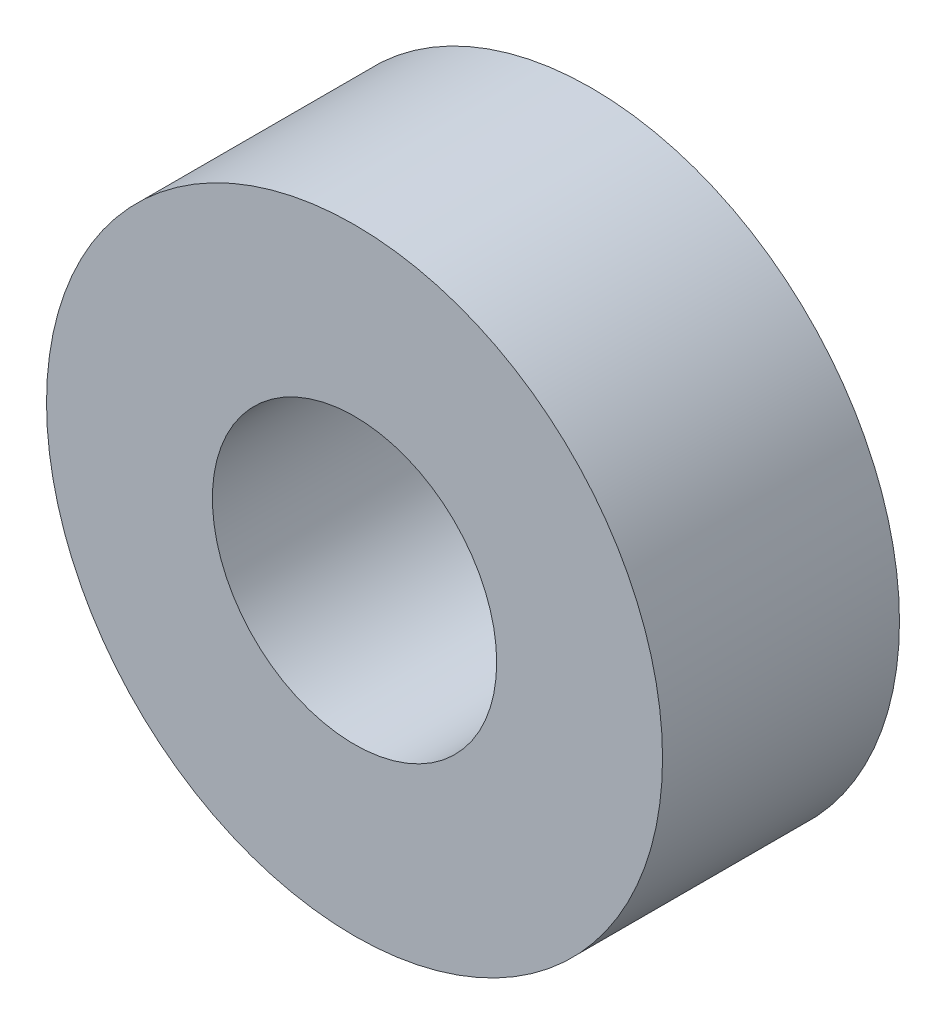
ISO-10303-21;
HEADER;
FILE_DESCRIPTION(('STEP AP214'),'2;1');
FILE_NAME('part.step','',(''),(''),'','','');
FILE_SCHEMA(('AUTOMOTIVE_DESIGN { 1 0 10303 214 1 1 1 1 }'));
ENDSEC;
DATA;
#1=APPLICATION_CONTEXT('core data for automotive mechanical design processes');
#2=APPLICATION_PROTOCOL_DEFINITION('international standard','automotive_design',2000,#1);
#3=PRODUCT_CONTEXT('',#1,'mechanical');
#4=PRODUCT('Part','Part','',(#3));
#5=PRODUCT_RELATED_PRODUCT_CATEGORY('part','',(#4));
#6=PRODUCT_DEFINITION_FORMATION('','',#4);
#7=PRODUCT_DEFINITION_CONTEXT('part definition',#1,'design');
#8=PRODUCT_DEFINITION('design','',#6,#7);
#9=PRODUCT_DEFINITION_SHAPE('','',#8);
#10=(LENGTH_UNIT() NAMED_UNIT(*) SI_UNIT(.MILLI.,.METRE.));
#11=(NAMED_UNIT(*) PLANE_ANGLE_UNIT() SI_UNIT($,.RADIAN.));
#12=(NAMED_UNIT(*) SI_UNIT($,.STERADIAN.) SOLID_ANGLE_UNIT());
#13=UNCERTAINTY_MEASURE_WITH_UNIT(LENGTH_MEASURE(1.E-05),#10,'distance_accuracy_value','');
#14=(GEOMETRIC_REPRESENTATION_CONTEXT(3) GLOBAL_UNCERTAINTY_ASSIGNED_CONTEXT((#13)) GLOBAL_UNIT_ASSIGNED_CONTEXT((#10,
#11,#12)) REPRESENTATION_CONTEXT('',''));
#15=CARTESIAN_POINT('',(0.,0.,0.));
#16=DIRECTION('',(0.,0.,1.));
#17=DIRECTION('',(1.,0.,0.));
#18=AXIS2_PLACEMENT_3D('',#15,#16,#17);
#19=CARTESIAN_POINT('',(-61.9999999999997,2.68207198850851E-11,-5.));
#20=DIRECTION('',(0.,0.,1.));
#21=DIRECTION('',(1.,0.,0.));
#22=AXIS2_PLACEMENT_3D('',#19,#20,#21);
#23=CYLINDRICAL_SURFACE('',#22,6.49999999999795);
#24=CARTESIAN_POINT('',(-61.9999999999997,2.68207198850851E-11,-5.));
#25=DIRECTION('',(0.,0.,1.));
#26=DIRECTION('',(1.,0.,0.));
#27=AXIS2_PLACEMENT_3D('',#24,#25,#26);
#28=CIRCLE('',#27,6.49999999999795);
#29=CARTESIAN_POINT('',(-55.5000000000017,2.68207198850851E-11,-5.));
#30=VERTEX_POINT('',#29);
#31=EDGE_CURVE('E10',#30,#30,#28,.T.);
#32=ORIENTED_EDGE('',*,*,#31,.T.);
#33=EDGE_LOOP('',(#32));
#34=FACE_BOUND('',#33,.T.);
#35=CARTESIAN_POINT('',(-61.9999999999997,2.68207198850851E-11,0.));
#36=DIRECTION('',(0.,0.,1.));
#37=DIRECTION('',(1.,0.,0.));
#38=AXIS2_PLACEMENT_3D('',#35,#36,#37);
#39=CIRCLE('',#38,6.49999999999795);
#40=CARTESIAN_POINT('',(-55.5000000000017,2.68207198850851E-11,0.));
#41=VERTEX_POINT('',#40);
#42=EDGE_CURVE('E33',#41,#41,#39,.T.);
#43=ORIENTED_EDGE('',*,*,#42,.F.);
#44=EDGE_LOOP('',(#43));
#45=FACE_BOUND('',#44,.T.);
#46=ADVANCED_FACE('F30',(#34,#45),#23,.T.);
#47=CARTESIAN_POINT('',(-61.9999999999997,2.68207198850851E-11,-5.));
#48=DIRECTION('',(0.,0.,1.));
#49=DIRECTION('',(1.,0.,0.));
#50=AXIS2_PLACEMENT_3D('',#47,#48,#49);
#51=PLANE('',#50);
#52=CARTESIAN_POINT('',(-61.9999999999997,2.68207198850851E-11,-5.));
#53=DIRECTION('',(0.,0.,1.));
#54=DIRECTION('',(1.,0.,0.));
#55=AXIS2_PLACEMENT_3D('',#52,#53,#54);
#56=CIRCLE('',#55,3.);
#57=CARTESIAN_POINT('',(-58.9999999999997,2.68207198850851E-11,-5.));
#58=VERTEX_POINT('',#57);
#59=EDGE_CURVE('E40',#58,#58,#56,.T.);
#60=ORIENTED_EDGE('',*,*,#59,.T.);
#61=EDGE_LOOP('',(#60));
#62=FACE_BOUND('',#61,.T.);
#63=ORIENTED_EDGE('',*,*,#31,.F.);
#64=EDGE_LOOP('',(#63));
#65=FACE_BOUND('',#64,.T.);
#66=ADVANCED_FACE('F48',(#62,#65),#51,.F.);
#67=CARTESIAN_POINT('',(-61.9999999999997,2.68207198850851E-11,0.));
#68=DIRECTION('',(0.,0.,1.));
#69=DIRECTION('',(1.,0.,0.));
#70=AXIS2_PLACEMENT_3D('',#67,#68,#69);
#71=PLANE('',#70);
#72=CARTESIAN_POINT('',(-61.9999999999997,2.68207198850851E-11,0.));
#73=DIRECTION('',(0.,0.,1.));
#74=DIRECTION('',(1.,0.,0.));
#75=AXIS2_PLACEMENT_3D('',#72,#73,#74);
#76=CIRCLE('',#75,3.);
#77=CARTESIAN_POINT('',(-58.9999999999997,2.68207198850851E-11,0.));
#78=VERTEX_POINT('',#77);
#79=EDGE_CURVE('E42',#78,#78,#76,.T.);
#80=ORIENTED_EDGE('',*,*,#79,.F.);
#81=EDGE_LOOP('',(#80));
#82=FACE_BOUND('',#81,.T.);
#83=ORIENTED_EDGE('',*,*,#42,.T.);
#84=EDGE_LOOP('',(#83));
#85=FACE_BOUND('',#84,.T.);
#86=ADVANCED_FACE('F54',(#82,#85),#71,.T.);
#87=CARTESIAN_POINT('',(-61.9999999999997,2.68207198850851E-11,-5.));
#88=DIRECTION('',(0.,0.,1.));
#89=DIRECTION('',(1.,0.,0.));
#90=AXIS2_PLACEMENT_3D('',#87,#88,#89);
#91=CYLINDRICAL_SURFACE('',#90,3.);
#92=ORIENTED_EDGE('',*,*,#59,.F.);
#93=EDGE_LOOP('',(#92));
#94=FACE_BOUND('',#93,.T.);
#95=ORIENTED_EDGE('',*,*,#79,.T.);
#96=EDGE_LOOP('',(#95));
#97=FACE_BOUND('',#96,.T.);
#98=ADVANCED_FACE('F51',(#94,#97),#91,.F.);
#99=CLOSED_SHELL('',(#46,#66,#86,#98));
#100=MANIFOLD_SOLID_BREP('B2',#99);
#101=ADVANCED_BREP_SHAPE_REPRESENTATION('',(#18,#100),#14);
#102=SHAPE_DEFINITION_REPRESENTATION(#9,#101);
ENDSEC;
END-ISO-10303-21;
